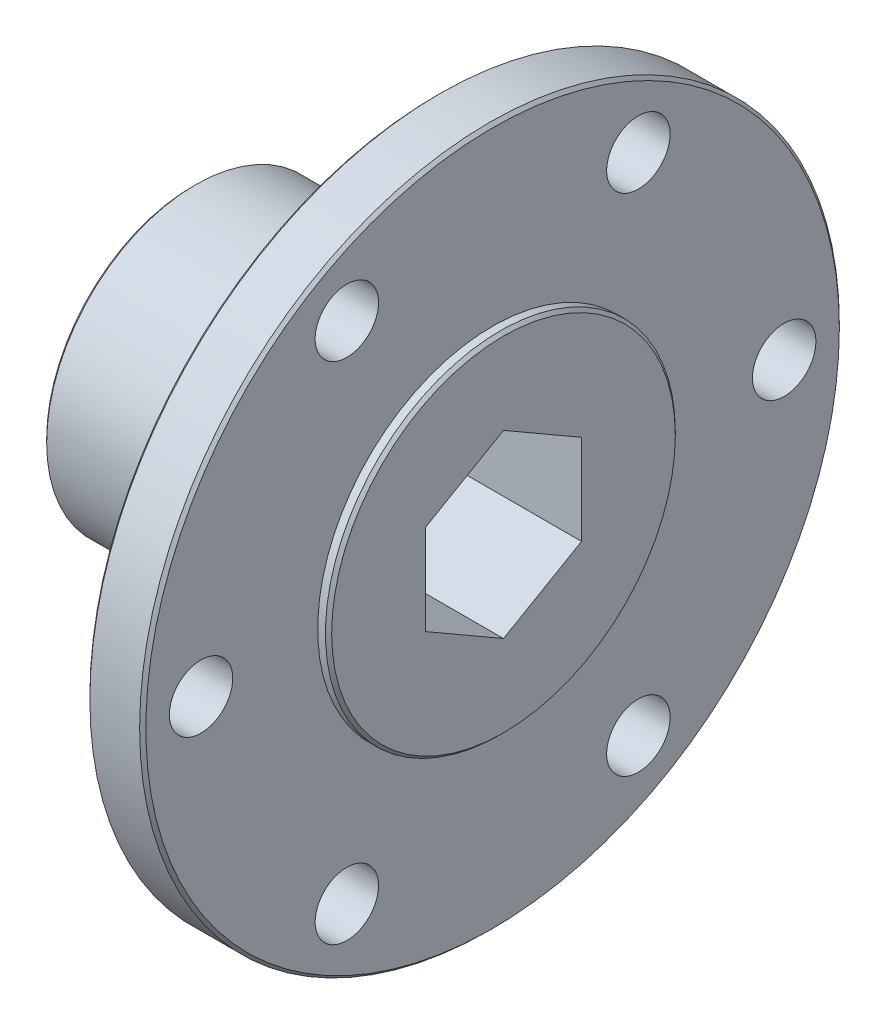
ISO-10303-21;
HEADER;
FILE_DESCRIPTION(('STEP AP214'),'2;1');
FILE_NAME('part.step','',(''),(''),'','','');
FILE_SCHEMA(('AUTOMOTIVE_DESIGN { 1 0 10303 214 1 1 1 1 }'));
ENDSEC;
DATA;
#1=APPLICATION_CONTEXT('core data for automotive mechanical design processes');
#2=APPLICATION_PROTOCOL_DEFINITION('international standard','automotive_design',2000,#1);
#3=PRODUCT_CONTEXT('',#1,'mechanical');
#4=PRODUCT('Part','Part','',(#3));
#5=PRODUCT_RELATED_PRODUCT_CATEGORY('part','',(#4));
#6=PRODUCT_DEFINITION_FORMATION('','',#4);
#7=PRODUCT_DEFINITION_CONTEXT('part definition',#1,'design');
#8=PRODUCT_DEFINITION('design','',#6,#7);
#9=PRODUCT_DEFINITION_SHAPE('','',#8);
#10=(LENGTH_UNIT() NAMED_UNIT(*) SI_UNIT(.MILLI.,.METRE.));
#11=(NAMED_UNIT(*) PLANE_ANGLE_UNIT() SI_UNIT($,.RADIAN.));
#12=(NAMED_UNIT(*) SI_UNIT($,.STERADIAN.) SOLID_ANGLE_UNIT());
#13=UNCERTAINTY_MEASURE_WITH_UNIT(LENGTH_MEASURE(1.E-05),#10,'distance_accuracy_value','');
#14=(GEOMETRIC_REPRESENTATION_CONTEXT(3) GLOBAL_UNCERTAINTY_ASSIGNED_CONTEXT((#13)) GLOBAL_UNIT_ASSIGNED_CONTEXT((#10,
#11,#12)) REPRESENTATION_CONTEXT('',''));
#15=CARTESIAN_POINT('',(0.,0.,0.));
#16=DIRECTION('',(0.,0.,1.));
#17=DIRECTION('',(1.,0.,0.));
#18=AXIS2_PLACEMENT_3D('',#15,#16,#17);
#19=CARTESIAN_POINT('',(-6.01493375394323,0.,0.));
#20=DIRECTION('',(1.,0.,0.));
#21=DIRECTION('',(0.,0.,-1.));
#22=AXIS2_PLACEMENT_3D('',#19,#20,#21);
#23=CYLINDRICAL_SURFACE('',#22,12.1666);
#24=CARTESIAN_POINT('',(-5.76093375394312,0.,0.));
#25=DIRECTION('',(-1.,0.,0.));
#26=DIRECTION('',(0.,0.,1.));
#27=AXIS2_PLACEMENT_3D('',#24,#25,#26);
#28=CIRCLE('',#27,12.1666);
#29=CARTESIAN_POINT('',(-5.76093375394312,0.,12.1666));
#30=VERTEX_POINT('',#29);
#31=EDGE_CURVE('E191',#30,#30,#28,.F.);
#32=ORIENTED_EDGE('',*,*,#31,.T.);
#33=EDGE_LOOP('',(#32));
#34=FACE_BOUND('',#33,.T.);
#35=CARTESIAN_POINT('',(12.2222662460567,0.,0.));
#36=DIRECTION('',(1.,0.,0.));
#37=DIRECTION('',(0.,0.,-1.));
#38=AXIS2_PLACEMENT_3D('',#35,#36,#37);
#39=CIRCLE('',#38,12.1666);
#40=CARTESIAN_POINT('',(12.2222662460567,0.,-12.1666));
#41=VERTEX_POINT('',#40);
#42=EDGE_CURVE('E158',#41,#41,#39,.T.);
#43=ORIENTED_EDGE('',*,*,#42,.F.);
#44=EDGE_LOOP('',(#43));
#45=FACE_BOUND('',#44,.T.);
#46=ADVANCED_FACE('F33',(#34,#45),#23,.T.);
#47=CARTESIAN_POINT('',(-6.01493375394323,12.1666,0.));
#48=DIRECTION('',(-1.,0.,0.));
#49=DIRECTION('',(0.,0.,1.));
#50=AXIS2_PLACEMENT_3D('',#47,#48,#49);
#51=PLANE('',#50);
#52=CARTESIAN_POINT('',(-6.01493375394323,0.,0.));
#53=DIRECTION('',(-1.,0.,0.));
#54=DIRECTION('',(0.,0.,1.));
#55=AXIS2_PLACEMENT_3D('',#52,#53,#54);
#56=CIRCLE('',#55,11.9125999999999);
#57=CARTESIAN_POINT('',(-6.01493375394323,0.,11.9125999999999));
#58=VERTEX_POINT('',#57);
#59=EDGE_CURVE('E194',#58,#58,#56,.T.);
#60=ORIENTED_EDGE('',*,*,#59,.T.);
#61=EDGE_LOOP('',(#60));
#62=FACE_BOUND('',#61,.T.);
#63=DIRECTION('',(0.,0.500000000000001,0.866025403784438));
#64=VECTOR('',#63,1.);
#65=CARTESIAN_POINT('',(-6.01493375394323,3.68081890619155,-6.3754));
#66=LINE('',#65,#64);
#67=CARTESIAN_POINT('',(-6.01493375394323,3.68081890619155,-6.3754));
#68=VERTEX_POINT('',#67);
#69=CARTESIAN_POINT('',(-6.01493375394323,7.3616578123831,0.));
#70=VERTEX_POINT('',#69);
#71=EDGE_CURVE('E88',#68,#70,#66,.T.);
#72=ORIENTED_EDGE('',*,*,#71,.T.);
#73=DIRECTION('',(0.,-0.500000000000001,0.866025403784438));
#74=VECTOR('',#73,1.);
#75=CARTESIAN_POINT('',(-6.01493375394323,7.3616578123831,0.));
#76=LINE('',#75,#74);
#77=CARTESIAN_POINT('',(-6.01493375394323,3.68081890619155,6.37539999999999));
#78=VERTEX_POINT('',#77);
#79=EDGE_CURVE('E97',#70,#78,#76,.T.);
#80=ORIENTED_EDGE('',*,*,#79,.T.);
#81=DIRECTION('',(0.,-1.,0.));
#82=VECTOR('',#81,1.);
#83=CARTESIAN_POINT('',(-6.01493375394323,3.68081890619155,6.37539999999999));
#84=LINE('',#83,#82);
#85=CARTESIAN_POINT('',(-6.01493375394323,-3.68085890619153,6.37539999999999));
#86=VERTEX_POINT('',#85);
#87=EDGE_CURVE('E48',#78,#86,#84,.T.);
#88=ORIENTED_EDGE('',*,*,#87,.T.);
#89=DIRECTION('',(0.,-0.500000000000001,-0.866025403784438));
#90=VECTOR('',#89,1.);
#91=CARTESIAN_POINT('',(-6.01493375394323,-3.68085890619153,6.37539999999999));
#92=LINE('',#91,#90);
#93=CARTESIAN_POINT('',(-6.01493375394323,-7.36169781238308,0.));
#94=VERTEX_POINT('',#93);
#95=EDGE_CURVE('E111',#86,#94,#92,.T.);
#96=ORIENTED_EDGE('',*,*,#95,.T.);
#97=DIRECTION('',(0.,0.500000000000001,-0.866025403784438));
#98=VECTOR('',#97,1.);
#99=CARTESIAN_POINT('',(-6.01493375394323,-7.36169781238308,0.));
#100=LINE('',#99,#98);
#101=CARTESIAN_POINT('',(-6.01493375394323,-3.68085890619153,-6.3754));
#102=VERTEX_POINT('',#101);
#103=EDGE_CURVE('E114',#94,#102,#100,.T.);
#104=ORIENTED_EDGE('',*,*,#103,.T.);
#105=DIRECTION('',(0.,1.,0.));
#106=VECTOR('',#105,1.);
#107=CARTESIAN_POINT('',(-6.01493375394323,-3.68085890619153,-6.3754));
#108=LINE('',#107,#106);
#109=EDGE_CURVE('E94',#102,#68,#108,.T.);
#110=ORIENTED_EDGE('',*,*,#109,.T.);
#111=EDGE_LOOP('',(#72,#80,#88,#96,#104,#110));
#112=FACE_BOUND('',#111,.T.);
#113=ADVANCED_FACE('F101',(#62,#112),#51,.T.);
#114=CARTESIAN_POINT('',(19.3850662460568,0.,0.));
#115=DIRECTION('',(1.,0.,0.));
#116=DIRECTION('',(0.,0.,-1.));
#117=AXIS2_PLACEMENT_3D('',#114,#115,#116);
#118=PLANE('',#117);
#119=CARTESIAN_POINT('',(19.3850662460568,0.,0.));
#120=DIRECTION('',(1.,0.,0.));
#121=DIRECTION('',(0.,0.,-1.));
#122=AXIS2_PLACEMENT_3D('',#119,#120,#121);
#123=CIRCLE('',#122,14.0334999999999);
#124=CARTESIAN_POINT('',(19.3850662460568,0.,-14.0334999999999));
#125=VERTEX_POINT('',#124);
#126=EDGE_CURVE('E170',#125,#125,#123,.T.);
#127=ORIENTED_EDGE('',*,*,#126,.T.);
#128=EDGE_LOOP('',(#127));
#129=FACE_BOUND('',#128,.T.);
#130=DIRECTION('',(0.,0.500000000000001,0.866025403784438));
#131=VECTOR('',#130,1.);
#132=CARTESIAN_POINT('',(19.3850662460568,3.68081890619155,-6.3754));
#133=LINE('',#132,#131);
#134=CARTESIAN_POINT('',(19.3850662460568,3.68081890619155,-6.3754));
#135=VERTEX_POINT('',#134);
#136=CARTESIAN_POINT('',(19.3850662460568,7.3616578123831,0.));
#137=VERTEX_POINT('',#136);
#138=EDGE_CURVE('E56',#135,#137,#133,.T.);
#139=ORIENTED_EDGE('',*,*,#138,.F.);
#140=DIRECTION('',(0.,1.,0.));
#141=VECTOR('',#140,1.);
#142=CARTESIAN_POINT('',(19.3850662460568,-3.68085890619153,-6.3754));
#143=LINE('',#142,#141);
#144=CARTESIAN_POINT('',(19.3850662460568,-3.68085890619153,-6.3754));
#145=VERTEX_POINT('',#144);
#146=EDGE_CURVE('E104',#145,#135,#143,.T.);
#147=ORIENTED_EDGE('',*,*,#146,.F.);
#148=DIRECTION('',(0.,0.500000000000001,-0.866025403784438));
#149=VECTOR('',#148,1.);
#150=CARTESIAN_POINT('',(19.3850662460568,-7.36169781238308,0.));
#151=LINE('',#150,#149);
#152=CARTESIAN_POINT('',(19.3850662460568,-7.36169781238308,0.));
#153=VERTEX_POINT('',#152);
#154=EDGE_CURVE('E107',#153,#145,#151,.T.);
#155=ORIENTED_EDGE('',*,*,#154,.F.);
#156=DIRECTION('',(0.,-0.500000000000001,-0.866025403784438));
#157=VECTOR('',#156,1.);
#158=CARTESIAN_POINT('',(19.3850662460568,-3.68085890619153,6.37539999999999));
#159=LINE('',#158,#157);
#160=CARTESIAN_POINT('',(19.3850662460568,-3.68085890619153,6.37539999999999));
#161=VERTEX_POINT('',#160);
#162=EDGE_CURVE('E123',#161,#153,#159,.T.);
#163=ORIENTED_EDGE('',*,*,#162,.F.);
#164=DIRECTION('',(0.,-1.,0.));
#165=VECTOR('',#164,1.);
#166=CARTESIAN_POINT('',(19.3850662460568,3.68081890619155,6.37539999999999));
#167=LINE('',#166,#165);
#168=CARTESIAN_POINT('',(19.3850662460568,3.68081890619155,6.37539999999999));
#169=VERTEX_POINT('',#168);
#170=EDGE_CURVE('E120',#169,#161,#167,.T.);
#171=ORIENTED_EDGE('',*,*,#170,.F.);
#172=DIRECTION('',(0.,-0.500000000000001,0.866025403784438));
#173=VECTOR('',#172,1.);
#174=CARTESIAN_POINT('',(19.3850662460568,7.3616578123831,0.));
#175=LINE('',#174,#173);
#176=EDGE_CURVE('E118',#137,#169,#175,.T.);
#177=ORIENTED_EDGE('',*,*,#176,.F.);
#178=EDGE_LOOP('',(#139,#147,#155,#163,#171,#177));
#179=FACE_BOUND('',#178,.T.);
#180=ADVANCED_FACE('F244',(#129,#179),#118,.T.);
#181=CARTESIAN_POINT('',(-6.01493375394323,0.,0.));
#182=DIRECTION('',(1.,0.,0.));
#183=DIRECTION('',(0.,0.,-1.));
#184=AXIS2_PLACEMENT_3D('',#181,#182,#183);
#185=CYLINDRICAL_SURFACE('',#184,14.2875);
#186=CARTESIAN_POINT('',(19.1310662460566,0.,0.));
#187=DIRECTION('',(1.,0.,0.));
#188=DIRECTION('',(0.,0.,-1.));
#189=AXIS2_PLACEMENT_3D('',#186,#187,#188);
#190=CIRCLE('',#189,14.2875);
#191=CARTESIAN_POINT('',(19.1310662460566,0.,-14.2875));
#192=VERTEX_POINT('',#191);
#193=EDGE_CURVE('E188',#192,#192,#190,.F.);
#194=ORIENTED_EDGE('',*,*,#193,.T.);
#195=EDGE_LOOP('',(#194));
#196=FACE_BOUND('',#195,.T.);
#197=CARTESIAN_POINT('',(18.4960662460568,0.,0.));
#198=DIRECTION('',(1.,0.,0.));
#199=DIRECTION('',(0.,0.,-1.));
#200=AXIS2_PLACEMENT_3D('',#197,#198,#199);
#201=CIRCLE('',#200,14.2875);
#202=CARTESIAN_POINT('',(18.4960662460568,0.,-14.2875));
#203=VERTEX_POINT('',#202);
#204=EDGE_CURVE('E167',#203,#203,#201,.T.);
#205=ORIENTED_EDGE('',*,*,#204,.T.);
#206=EDGE_LOOP('',(#205));
#207=FACE_BOUND('',#206,.T.);
#208=ADVANCED_FACE('F268',(#196,#207),#185,.T.);
#209=CARTESIAN_POINT('',(18.4960662460568,14.2875,0.));
#210=DIRECTION('',(1.,0.,0.));
#211=DIRECTION('',(0.,0.,-1.));
#212=AXIS2_PLACEMENT_3D('',#209,#210,#211);
#213=PLANE('',#212);
#214=CARTESIAN_POINT('',(18.4960662460568,0.,0.));
#215=DIRECTION('',(1.,0.,0.));
#216=DIRECTION('',(0.,0.,-1.));
#217=AXIS2_PLACEMENT_3D('',#214,#215,#216);
#218=CIRCLE('',#217,28.3209999999999);
#219=CARTESIAN_POINT('',(18.4960662460568,0.,-28.3209999999999));
#220=VERTEX_POINT('',#219);
#221=EDGE_CURVE('E197',#220,#220,#218,.T.);
#222=ORIENTED_EDGE('',*,*,#221,.T.);
#223=EDGE_LOOP('',(#222));
#224=FACE_BOUND('',#223,.T.);
#225=CARTESIAN_POINT('',(18.4960662460568,-20.622229927617,-11.90625));
#226=DIRECTION('',(1.,0.,0.));
#227=DIRECTION('',(0.,-0.866025403784439,0.5));
#228=AXIS2_PLACEMENT_3D('',#225,#226,#227);
#229=CIRCLE('',#228,2.59080000000001);
#230=CARTESIAN_POINT('',(18.4960662460568,-22.8659285437417,-10.61085));
#231=VERTEX_POINT('',#230);
#232=EDGE_CURVE('E138',#231,#231,#229,.T.);
#233=ORIENTED_EDGE('',*,*,#232,.F.);
#234=EDGE_LOOP('',(#233));
#235=FACE_BOUND('',#234,.T.);
#236=CARTESIAN_POINT('',(18.4960662460568,0.,-23.8125));
#237=DIRECTION('',(1.,0.,0.));
#238=DIRECTION('',(0.,-0.866025403784438,-0.500000000000001));
#239=AXIS2_PLACEMENT_3D('',#236,#237,#238);
#240=CIRCLE('',#239,2.59080000000001);
#241=CARTESIAN_POINT('',(18.4960662460568,-2.24369861612477,-25.1079));
#242=VERTEX_POINT('',#241);
#243=EDGE_CURVE('E142',#242,#242,#240,.T.);
#244=ORIENTED_EDGE('',*,*,#243,.F.);
#245=EDGE_LOOP('',(#244));
#246=FACE_BOUND('',#245,.T.);
#247=CARTESIAN_POINT('',(18.4960662460568,20.6222299276169,-11.90625));
#248=DIRECTION('',(1.,0.,0.));
#249=DIRECTION('',(0.,0.,-1.));
#250=AXIS2_PLACEMENT_3D('',#247,#248,#249);
#251=CIRCLE('',#250,2.59080000000001);
#252=CARTESIAN_POINT('',(18.4960662460568,20.6222299276169,-14.49705));
#253=VERTEX_POINT('',#252);
#254=EDGE_CURVE('E145',#253,#253,#251,.T.);
#255=ORIENTED_EDGE('',*,*,#254,.F.);
#256=EDGE_LOOP('',(#255));
#257=FACE_BOUND('',#256,.T.);
#258=CARTESIAN_POINT('',(18.4960662460568,20.622229927617,11.90625));
#259=DIRECTION('',(1.,0.,0.));
#260=DIRECTION('',(0.,0.866025403784439,-0.499999999999999));
#261=AXIS2_PLACEMENT_3D('',#258,#259,#260);
#262=CIRCLE('',#261,2.59080000000001);
#263=CARTESIAN_POINT('',(18.4960662460568,22.8659285437417,10.61085));
#264=VERTEX_POINT('',#263);
#265=EDGE_CURVE('E148',#264,#264,#262,.T.);
#266=ORIENTED_EDGE('',*,*,#265,.F.);
#267=EDGE_LOOP('',(#266));
#268=FACE_BOUND('',#267,.T.);
#269=CARTESIAN_POINT('',(18.4960662460568,0.,23.8125));
#270=DIRECTION('',(1.,0.,0.));
#271=DIRECTION('',(0.,0.866025403784438,0.500000000000002));
#272=AXIS2_PLACEMENT_3D('',#269,#270,#271);
#273=CIRCLE('',#272,2.59080000000001);
#274=CARTESIAN_POINT('',(18.4960662460568,2.24369861612474,25.1079));
#275=VERTEX_POINT('',#274);
#276=EDGE_CURVE('E130',#275,#275,#273,.T.);
#277=ORIENTED_EDGE('',*,*,#276,.F.);
#278=EDGE_LOOP('',(#277));
#279=FACE_BOUND('',#278,.T.);
#280=CARTESIAN_POINT('',(18.4960662460568,-20.6222299276169,11.90625));
#281=DIRECTION('',(1.,0.,0.));
#282=DIRECTION('',(0.,0.,1.));
#283=AXIS2_PLACEMENT_3D('',#280,#281,#282);
#284=CIRCLE('',#283,2.59080000000001);
#285=CARTESIAN_POINT('',(18.4960662460568,-20.6222299276169,14.4970500000001));
#286=VERTEX_POINT('',#285);
#287=EDGE_CURVE('E153',#286,#286,#284,.T.);
#288=ORIENTED_EDGE('',*,*,#287,.F.);
#289=EDGE_LOOP('',(#288));
#290=FACE_BOUND('',#289,.T.);
#291=ORIENTED_EDGE('',*,*,#204,.F.);
#292=EDGE_LOOP('',(#291));
#293=FACE_BOUND('',#292,.T.);
#294=ADVANCED_FACE('F234',(#224,#235,#246,#257,#268,#279,#290,#293),#213,.T.);
#295=CARTESIAN_POINT('',(-6.01493375394323,0.,0.));
#296=DIRECTION('',(1.,0.,0.));
#297=DIRECTION('',(0.,0.,-1.));
#298=AXIS2_PLACEMENT_3D('',#295,#296,#297);
#299=CYLINDRICAL_SURFACE('',#298,28.575);
#300=CARTESIAN_POINT('',(18.2420662460567,0.,0.));
#301=DIRECTION('',(1.,0.,0.));
#302=DIRECTION('',(0.,0.,-1.));
#303=AXIS2_PLACEMENT_3D('',#300,#301,#302);
#304=CIRCLE('',#303,28.575);
#305=CARTESIAN_POINT('',(18.2420662460567,0.,-28.575));
#306=VERTEX_POINT('',#305);
#307=EDGE_CURVE('E203',#306,#306,#304,.F.);
#308=ORIENTED_EDGE('',*,*,#307,.T.);
#309=EDGE_LOOP('',(#308));
#310=FACE_BOUND('',#309,.T.);
#311=CARTESIAN_POINT('',(14.1780662460569,0.,0.));
#312=DIRECTION('',(-1.,0.,0.));
#313=DIRECTION('',(0.,0.,1.));
#314=AXIS2_PLACEMENT_3D('',#311,#312,#313);
#315=CIRCLE('',#314,28.575);
#316=CARTESIAN_POINT('',(14.1780662460569,0.,28.575));
#317=VERTEX_POINT('',#316);
#318=EDGE_CURVE('E200',#317,#317,#315,.F.);
#319=ORIENTED_EDGE('',*,*,#318,.T.);
#320=EDGE_LOOP('',(#319));
#321=FACE_BOUND('',#320,.T.);
#322=ADVANCED_FACE('F228',(#310,#321),#299,.T.);
#323=CARTESIAN_POINT('',(13.9240662460568,28.575,0.));
#324=DIRECTION('',(-1.,0.,0.));
#325=DIRECTION('',(0.,0.,1.));
#326=AXIS2_PLACEMENT_3D('',#323,#324,#325);
#327=PLANE('',#326);
#328=CARTESIAN_POINT('',(13.9240662460568,0.,0.));
#329=DIRECTION('',(-1.,0.,0.));
#330=DIRECTION('',(0.,0.,1.));
#331=AXIS2_PLACEMENT_3D('',#328,#329,#330);
#332=CIRCLE('',#331,28.3209999999999);
#333=CARTESIAN_POINT('',(13.9240662460568,0.,28.3209999999999));
#334=VERTEX_POINT('',#333);
#335=EDGE_CURVE('E11',#334,#334,#332,.T.);
#336=ORIENTED_EDGE('',*,*,#335,.T.);
#337=EDGE_LOOP('',(#336));
#338=FACE_BOUND('',#337,.T.);
#339=CARTESIAN_POINT('',(13.9240662460568,-20.622229927617,-11.90625));
#340=DIRECTION('',(-1.,0.,0.));
#341=DIRECTION('',(0.,0.,1.));
#342=AXIS2_PLACEMENT_3D('',#339,#340,#341);
#343=CIRCLE('',#342,2.59080000000001);
#344=CARTESIAN_POINT('',(13.9240662460568,-20.622229927617,-9.31544999999995));
#345=VERTEX_POINT('',#344);
#346=EDGE_CURVE('E157',#345,#345,#343,.T.);
#347=ORIENTED_EDGE('',*,*,#346,.F.);
#348=EDGE_LOOP('',(#347));
#349=FACE_BOUND('',#348,.T.);
#350=CARTESIAN_POINT('',(13.9240662460568,0.,-23.8125));
#351=DIRECTION('',(-1.,0.,0.));
#352=DIRECTION('',(0.,0.,1.));
#353=AXIS2_PLACEMENT_3D('',#350,#351,#352);
#354=CIRCLE('',#353,2.59080000000001);
#355=CARTESIAN_POINT('',(13.9240662460568,0.,-21.2217));
#356=VERTEX_POINT('',#355);
#357=EDGE_CURVE('E181',#356,#356,#354,.T.);
#358=ORIENTED_EDGE('',*,*,#357,.F.);
#359=EDGE_LOOP('',(#358));
#360=FACE_BOUND('',#359,.T.);
#361=CARTESIAN_POINT('',(13.9240662460568,20.6222299276169,-11.90625));
#362=DIRECTION('',(-1.,0.,0.));
#363=DIRECTION('',(0.,0.,1.));
#364=AXIS2_PLACEMENT_3D('',#361,#362,#363);
#365=CIRCLE('',#364,2.59080000000001);
#366=CARTESIAN_POINT('',(13.9240662460568,20.6222299276169,-9.31545000000001));
#367=VERTEX_POINT('',#366);
#368=EDGE_CURVE('E178',#367,#367,#365,.T.);
#369=ORIENTED_EDGE('',*,*,#368,.F.);
#370=EDGE_LOOP('',(#369));
#371=FACE_BOUND('',#370,.T.);
#372=CARTESIAN_POINT('',(13.9240662460568,20.622229927617,11.90625));
#373=DIRECTION('',(-1.,0.,0.));
#374=DIRECTION('',(0.,0.,1.));
#375=AXIS2_PLACEMENT_3D('',#372,#373,#374);
#376=CIRCLE('',#375,2.59080000000001);
#377=CARTESIAN_POINT('',(13.9240662460568,20.622229927617,14.49705));
#378=VERTEX_POINT('',#377);
#379=EDGE_CURVE('E175',#378,#378,#376,.T.);
#380=ORIENTED_EDGE('',*,*,#379,.F.);
#381=EDGE_LOOP('',(#380));
#382=FACE_BOUND('',#381,.T.);
#383=CARTESIAN_POINT('',(13.9240662460568,0.,23.8125));
#384=DIRECTION('',(-1.,0.,0.));
#385=DIRECTION('',(0.,0.,1.));
#386=AXIS2_PLACEMENT_3D('',#383,#384,#385);
#387=CIRCLE('',#386,2.59080000000001);
#388=CARTESIAN_POINT('',(13.9240662460568,0.,26.4033));
#389=VERTEX_POINT('',#388);
#390=EDGE_CURVE('E141',#389,#389,#387,.T.);
#391=ORIENTED_EDGE('',*,*,#390,.F.);
#392=EDGE_LOOP('',(#391));
#393=FACE_BOUND('',#392,.T.);
#394=CARTESIAN_POINT('',(13.9240662460568,-20.6222299276169,11.90625));
#395=DIRECTION('',(-1.,0.,0.));
#396=DIRECTION('',(0.,0.,1.));
#397=AXIS2_PLACEMENT_3D('',#394,#395,#396);
#398=CIRCLE('',#397,2.59080000000001);
#399=CARTESIAN_POINT('',(13.9240662460568,-20.6222299276169,14.4970500000001));
#400=VERTEX_POINT('',#399);
#401=EDGE_CURVE('E156',#400,#400,#398,.T.);
#402=ORIENTED_EDGE('',*,*,#401,.F.);
#403=EDGE_LOOP('',(#402));
#404=FACE_BOUND('',#403,.T.);
#405=CARTESIAN_POINT('',(13.9240662460568,0.,0.));
#406=DIRECTION('',(1.,0.,0.));
#407=DIRECTION('',(0.,0.,-1.));
#408=AXIS2_PLACEMENT_3D('',#405,#406,#407);
#409=CIRCLE('',#408,14.2875);
#410=CARTESIAN_POINT('',(13.9240662460568,0.,-14.2875));
#411=VERTEX_POINT('',#410);
#412=EDGE_CURVE('E164',#411,#411,#409,.T.);
#413=ORIENTED_EDGE('',*,*,#412,.T.);
#414=EDGE_LOOP('',(#413));
#415=FACE_BOUND('',#414,.T.);
#416=ADVANCED_FACE('F223',(#338,#349,#360,#371,#382,#393,#404,#415),#327,.T.);
#417=CARTESIAN_POINT('',(-6.01493375394323,0.,0.));
#418=DIRECTION('',(1.,0.,0.));
#419=DIRECTION('',(0.,0.,-1.));
#420=AXIS2_PLACEMENT_3D('',#417,#418,#419);
#421=CYLINDRICAL_SURFACE('',#420,14.2875);
#422=CARTESIAN_POINT('',(13.2890662460569,0.,0.));
#423=DIRECTION('',(-1.,0.,0.));
#424=DIRECTION('',(0.,0.,1.));
#425=AXIS2_PLACEMENT_3D('',#422,#423,#424);
#426=CIRCLE('',#425,14.2875);
#427=CARTESIAN_POINT('',(13.2890662460569,0.,14.2875));
#428=VERTEX_POINT('',#427);
#429=EDGE_CURVE('E206',#428,#428,#426,.F.);
#430=ORIENTED_EDGE('',*,*,#429,.T.);
#431=EDGE_LOOP('',(#430));
#432=FACE_BOUND('',#431,.T.);
#433=ORIENTED_EDGE('',*,*,#412,.F.);
#434=EDGE_LOOP('',(#433));
#435=FACE_BOUND('',#434,.T.);
#436=ADVANCED_FACE('F220',(#432,#435),#421,.T.);
#437=CARTESIAN_POINT('',(13.0350662460568,14.2875,0.));
#438=DIRECTION('',(-1.,0.,0.));
#439=DIRECTION('',(0.,0.,1.));
#440=AXIS2_PLACEMENT_3D('',#437,#438,#439);
#441=PLANE('',#440);
#442=CARTESIAN_POINT('',(13.0350662460568,0.,0.));
#443=DIRECTION('',(-1.,0.,0.));
#444=DIRECTION('',(0.,0.,1.));
#445=AXIS2_PLACEMENT_3D('',#442,#443,#444);
#446=CIRCLE('',#445,14.0334999999999);
#447=CARTESIAN_POINT('',(13.0350662460568,0.,14.0334999999999));
#448=VERTEX_POINT('',#447);
#449=EDGE_CURVE('E41',#448,#448,#446,.T.);
#450=ORIENTED_EDGE('',*,*,#449,.T.);
#451=EDGE_LOOP('',(#450));
#452=FACE_BOUND('',#451,.T.);
#453=CARTESIAN_POINT('',(13.0350662460568,0.,0.));
#454=DIRECTION('',(1.,0.,0.));
#455=DIRECTION('',(0.,0.,-1.));
#456=AXIS2_PLACEMENT_3D('',#453,#454,#455);
#457=CIRCLE('',#456,12.9794);
#458=CARTESIAN_POINT('',(13.0350662460568,0.,-12.9794));
#459=VERTEX_POINT('',#458);
#460=EDGE_CURVE('E161',#459,#459,#457,.T.);
#461=ORIENTED_EDGE('',*,*,#460,.T.);
#462=EDGE_LOOP('',(#461));
#463=FACE_BOUND('',#462,.T.);
#464=ADVANCED_FACE('F211',(#452,#463),#441,.T.);
#465=CARTESIAN_POINT('',(13.0350662460568,0.,0.));
#466=DIRECTION('',(1.,0.,0.));
#467=DIRECTION('',(0.,0.,-1.));
#468=AXIS2_PLACEMENT_3D('',#465,#466,#467);
#469=CONICAL_SURFACE('',#468,12.9794,0.785398163397438);
#470=ORIENTED_EDGE('',*,*,#42,.T.);
#471=EDGE_LOOP('',(#470));
#472=FACE_BOUND('',#471,.T.);
#473=ORIENTED_EDGE('',*,*,#460,.F.);
#474=EDGE_LOOP('',(#473));
#475=FACE_BOUND('',#474,.T.);
#476=ADVANCED_FACE('F346',(#472,#475),#469,.T.);
#477=CARTESIAN_POINT('',(-6.01493375394323,-20.6222299276169,11.90625));
#478=DIRECTION('',(1.,0.,0.));
#479=DIRECTION('',(0.,0.,-1.));
#480=AXIS2_PLACEMENT_3D('',#477,#478,#479);
#481=CYLINDRICAL_SURFACE('',#480,2.59080000000001);
#482=ORIENTED_EDGE('',*,*,#401,.T.);
#483=EDGE_LOOP('',(#482));
#484=FACE_BOUND('',#483,.T.);
#485=ORIENTED_EDGE('',*,*,#287,.T.);
#486=EDGE_LOOP('',(#485));
#487=FACE_BOUND('',#486,.T.);
#488=ADVANCED_FACE('F342',(#484,#487),#481,.F.);
#489=CARTESIAN_POINT('',(-6.01493375394323,0.,23.8125));
#490=DIRECTION('',(1.,0.,0.));
#491=DIRECTION('',(0.,0.,-1.));
#492=AXIS2_PLACEMENT_3D('',#489,#490,#491);
#493=CYLINDRICAL_SURFACE('',#492,2.59080000000001);
#494=ORIENTED_EDGE('',*,*,#390,.T.);
#495=EDGE_LOOP('',(#494));
#496=FACE_BOUND('',#495,.T.);
#497=ORIENTED_EDGE('',*,*,#276,.T.);
#498=EDGE_LOOP('',(#497));
#499=FACE_BOUND('',#498,.T.);
#500=ADVANCED_FACE('F338',(#496,#499),#493,.F.);
#501=CARTESIAN_POINT('',(-6.01493375394323,20.622229927617,11.90625));
#502=DIRECTION('',(1.,0.,0.));
#503=DIRECTION('',(0.,0.,-1.));
#504=AXIS2_PLACEMENT_3D('',#501,#502,#503);
#505=CYLINDRICAL_SURFACE('',#504,2.59080000000001);
#506=ORIENTED_EDGE('',*,*,#379,.T.);
#507=EDGE_LOOP('',(#506));
#508=FACE_BOUND('',#507,.T.);
#509=ORIENTED_EDGE('',*,*,#265,.T.);
#510=EDGE_LOOP('',(#509));
#511=FACE_BOUND('',#510,.T.);
#512=ADVANCED_FACE('F334',(#508,#511),#505,.F.);
#513=CARTESIAN_POINT('',(-6.01493375394323,20.6222299276169,-11.90625));
#514=DIRECTION('',(1.,0.,0.));
#515=DIRECTION('',(0.,0.,-1.));
#516=AXIS2_PLACEMENT_3D('',#513,#514,#515);
#517=CYLINDRICAL_SURFACE('',#516,2.59080000000001);
#518=ORIENTED_EDGE('',*,*,#368,.T.);
#519=EDGE_LOOP('',(#518));
#520=FACE_BOUND('',#519,.T.);
#521=ORIENTED_EDGE('',*,*,#254,.T.);
#522=EDGE_LOOP('',(#521));
#523=FACE_BOUND('',#522,.T.);
#524=ADVANCED_FACE('F330',(#520,#523),#517,.F.);
#525=CARTESIAN_POINT('',(-6.01493375394323,0.,-23.8125));
#526=DIRECTION('',(1.,0.,0.));
#527=DIRECTION('',(0.,0.,-1.));
#528=AXIS2_PLACEMENT_3D('',#525,#526,#527);
#529=CYLINDRICAL_SURFACE('',#528,2.59080000000001);
#530=ORIENTED_EDGE('',*,*,#357,.T.);
#531=EDGE_LOOP('',(#530));
#532=FACE_BOUND('',#531,.T.);
#533=ORIENTED_EDGE('',*,*,#243,.T.);
#534=EDGE_LOOP('',(#533));
#535=FACE_BOUND('',#534,.T.);
#536=ADVANCED_FACE('F326',(#532,#535),#529,.F.);
#537=CARTESIAN_POINT('',(-6.01493375394323,-20.622229927617,-11.90625));
#538=DIRECTION('',(1.,0.,0.));
#539=DIRECTION('',(0.,0.,-1.));
#540=AXIS2_PLACEMENT_3D('',#537,#538,#539);
#541=CYLINDRICAL_SURFACE('',#540,2.59080000000001);
#542=ORIENTED_EDGE('',*,*,#346,.T.);
#543=EDGE_LOOP('',(#542));
#544=FACE_BOUND('',#543,.T.);
#545=ORIENTED_EDGE('',*,*,#232,.T.);
#546=EDGE_LOOP('',(#545));
#547=FACE_BOUND('',#546,.T.);
#548=ADVANCED_FACE('F315',(#544,#547),#541,.F.);
#549=CARTESIAN_POINT('',(-6.01493375394323,3.68081890619155,-6.3754));
#550=DIRECTION('',(0.,0.866025403784438,-0.500000000000001));
#551=DIRECTION('',(0.,0.500000000000001,0.866025403784438));
#552=AXIS2_PLACEMENT_3D('',#549,#550,#551);
#553=PLANE('',#552);
#554=ORIENTED_EDGE('',*,*,#138,.T.);
#555=DIRECTION('',(1.,0.,0.));
#556=VECTOR('',#555,1.);
#557=CARTESIAN_POINT('',(-6.01493375394323,7.3616578123831,0.));
#558=LINE('',#557,#556);
#559=EDGE_CURVE('E84',#70,#137,#558,.T.);
#560=ORIENTED_EDGE('',*,*,#559,.F.);
#561=ORIENTED_EDGE('',*,*,#71,.F.);
#562=DIRECTION('',(1.,0.,0.));
#563=VECTOR('',#562,1.);
#564=CARTESIAN_POINT('',(-6.01493375394323,3.68081890619155,-6.3754));
#565=LINE('',#564,#563);
#566=EDGE_CURVE('E128',#68,#135,#565,.T.);
#567=ORIENTED_EDGE('',*,*,#566,.T.);
#568=EDGE_LOOP('',(#554,#560,#561,#567));
#569=FACE_BOUND('',#568,.T.);
#570=ADVANCED_FACE('F86',(#569),#553,.F.);
#571=CARTESIAN_POINT('',(-6.01493375394323,-3.68085890619153,-6.3754));
#572=DIRECTION('',(0.,0.,-1.));
#573=DIRECTION('',(0.,1.,0.));
#574=AXIS2_PLACEMENT_3D('',#571,#572,#573);
#575=PLANE('',#574);
#576=ORIENTED_EDGE('',*,*,#146,.T.);
#577=ORIENTED_EDGE('',*,*,#566,.F.);
#578=ORIENTED_EDGE('',*,*,#109,.F.);
#579=DIRECTION('',(1.,0.,0.));
#580=VECTOR('',#579,1.);
#581=CARTESIAN_POINT('',(-6.01493375394323,-3.68085890619153,-6.3754));
#582=LINE('',#581,#580);
#583=EDGE_CURVE('E131',#102,#145,#582,.T.);
#584=ORIENTED_EDGE('',*,*,#583,.T.);
#585=EDGE_LOOP('',(#576,#577,#578,#584));
#586=FACE_BOUND('',#585,.T.);
#587=ADVANCED_FACE('F307',(#586),#575,.F.);
#588=CARTESIAN_POINT('',(-6.01493375394323,-7.36169781238308,0.));
#589=DIRECTION('',(0.,-0.866025403784438,-0.500000000000001));
#590=DIRECTION('',(0.,0.500000000000001,-0.866025403784438));
#591=AXIS2_PLACEMENT_3D('',#588,#589,#590);
#592=PLANE('',#591);
#593=ORIENTED_EDGE('',*,*,#154,.T.);
#594=ORIENTED_EDGE('',*,*,#583,.F.);
#595=ORIENTED_EDGE('',*,*,#103,.F.);
#596=DIRECTION('',(1.,0.,0.));
#597=VECTOR('',#596,1.);
#598=CARTESIAN_POINT('',(-6.01493375394323,-7.36169781238308,0.));
#599=LINE('',#598,#597);
#600=EDGE_CURVE('E133',#94,#153,#599,.T.);
#601=ORIENTED_EDGE('',*,*,#600,.T.);
#602=EDGE_LOOP('',(#593,#594,#595,#601));
#603=FACE_BOUND('',#602,.T.);
#604=ADVANCED_FACE('F305',(#603),#592,.F.);
#605=CARTESIAN_POINT('',(-6.01493375394323,-3.68085890619153,6.37539999999999));
#606=DIRECTION('',(0.,-0.866025403784438,0.500000000000001));
#607=DIRECTION('',(0.,-0.500000000000001,-0.866025403784438));
#608=AXIS2_PLACEMENT_3D('',#605,#606,#607);
#609=PLANE('',#608);
#610=ORIENTED_EDGE('',*,*,#162,.T.);
#611=ORIENTED_EDGE('',*,*,#600,.F.);
#612=ORIENTED_EDGE('',*,*,#95,.F.);
#613=DIRECTION('',(1.,0.,0.));
#614=VECTOR('',#613,1.);
#615=CARTESIAN_POINT('',(-6.01493375394323,-3.68085890619153,6.37539999999999));
#616=LINE('',#615,#614);
#617=EDGE_CURVE('E135',#86,#161,#616,.T.);
#618=ORIENTED_EDGE('',*,*,#617,.T.);
#619=EDGE_LOOP('',(#610,#611,#612,#618));
#620=FACE_BOUND('',#619,.T.);
#621=ADVANCED_FACE('F302',(#620),#609,.F.);
#622=CARTESIAN_POINT('',(-6.01493375394323,3.68081890619155,6.37539999999999));
#623=DIRECTION('',(0.,0.,1.));
#624=DIRECTION('',(0.,-1.,0.));
#625=AXIS2_PLACEMENT_3D('',#622,#623,#624);
#626=PLANE('',#625);
#627=ORIENTED_EDGE('',*,*,#170,.T.);
#628=ORIENTED_EDGE('',*,*,#617,.F.);
#629=ORIENTED_EDGE('',*,*,#87,.F.);
#630=DIRECTION('',(1.,0.,0.));
#631=VECTOR('',#630,1.);
#632=CARTESIAN_POINT('',(-6.01493375394323,3.68081890619155,6.37539999999999));
#633=LINE('',#632,#631);
#634=EDGE_CURVE('E93',#78,#169,#633,.T.);
#635=ORIENTED_EDGE('',*,*,#634,.T.);
#636=EDGE_LOOP('',(#627,#628,#629,#635));
#637=FACE_BOUND('',#636,.T.);
#638=ADVANCED_FACE('F299',(#637),#626,.F.);
#639=CARTESIAN_POINT('',(-6.01493375394323,7.3616578123831,0.));
#640=DIRECTION('',(0.,0.866025403784438,0.500000000000001));
#641=DIRECTION('',(0.,-0.500000000000001,0.866025403784438));
#642=AXIS2_PLACEMENT_3D('',#639,#640,#641);
#643=PLANE('',#642);
#644=ORIENTED_EDGE('',*,*,#176,.T.);
#645=ORIENTED_EDGE('',*,*,#634,.F.);
#646=ORIENTED_EDGE('',*,*,#79,.F.);
#647=ORIENTED_EDGE('',*,*,#559,.T.);
#648=EDGE_LOOP('',(#644,#645,#646,#647));
#649=FACE_BOUND('',#648,.T.);
#650=ADVANCED_FACE('F98',(#649),#643,.F.);
#651=CARTESIAN_POINT('',(19.3850662460568,0.,0.));
#652=DIRECTION('',(-1.,0.,0.));
#653=DIRECTION('',(0.,0.,1.));
#654=AXIS2_PLACEMENT_3D('',#651,#652,#653);
#655=CONICAL_SURFACE('',#654,14.0334999999999,0.785398163397448);
#656=ORIENTED_EDGE('',*,*,#193,.F.);
#657=EDGE_LOOP('',(#656));
#658=FACE_BOUND('',#657,.T.);
#659=ORIENTED_EDGE('',*,*,#126,.F.);
#660=EDGE_LOOP('',(#659));
#661=FACE_BOUND('',#660,.T.);
#662=ADVANCED_FACE('F250',(#658,#661),#655,.T.);
#663=CARTESIAN_POINT('',(-5.76093375394312,0.,0.));
#664=DIRECTION('',(1.,0.,0.));
#665=DIRECTION('',(0.,0.,-1.));
#666=AXIS2_PLACEMENT_3D('',#663,#664,#665);
#667=CONICAL_SURFACE('',#666,12.1666,0.785398163397452);
#668=ORIENTED_EDGE('',*,*,#59,.F.);
#669=EDGE_LOOP('',(#668));
#670=FACE_BOUND('',#669,.T.);
#671=ORIENTED_EDGE('',*,*,#31,.F.);
#672=EDGE_LOOP('',(#671));
#673=FACE_BOUND('',#672,.T.);
#674=ADVANCED_FACE('F253',(#670,#673),#667,.T.);
#675=CARTESIAN_POINT('',(18.4960662460568,0.,0.));
#676=DIRECTION('',(-1.,0.,0.));
#677=DIRECTION('',(0.,0.,1.));
#678=AXIS2_PLACEMENT_3D('',#675,#676,#677);
#679=CONICAL_SURFACE('',#678,28.3209999999999,0.785398163397455);
#680=ORIENTED_EDGE('',*,*,#307,.F.);
#681=EDGE_LOOP('',(#680));
#682=FACE_BOUND('',#681,.T.);
#683=ORIENTED_EDGE('',*,*,#221,.F.);
#684=EDGE_LOOP('',(#683));
#685=FACE_BOUND('',#684,.T.);
#686=ADVANCED_FACE('F217',(#682,#685),#679,.T.);
#687=CARTESIAN_POINT('',(13.2890662460569,0.,0.));
#688=DIRECTION('',(1.,0.,0.));
#689=DIRECTION('',(0.,0.,-1.));
#690=AXIS2_PLACEMENT_3D('',#687,#688,#689);
#691=CONICAL_SURFACE('',#690,14.2875,0.785398163397452);
#692=ORIENTED_EDGE('',*,*,#449,.F.);
#693=EDGE_LOOP('',(#692));
#694=FACE_BOUND('',#693,.T.);
#695=ORIENTED_EDGE('',*,*,#429,.F.);
#696=EDGE_LOOP('',(#695));
#697=FACE_BOUND('',#696,.T.);
#698=ADVANCED_FACE('F214',(#694,#697),#691,.T.);
#699=CARTESIAN_POINT('',(14.1780662460569,0.,0.));
#700=DIRECTION('',(1.,0.,0.));
#701=DIRECTION('',(0.,0.,-1.));
#702=AXIS2_PLACEMENT_3D('',#699,#700,#701);
#703=CONICAL_SURFACE('',#702,28.575,0.785398163397455);
#704=ORIENTED_EDGE('',*,*,#335,.F.);
#705=EDGE_LOOP('',(#704));
#706=FACE_BOUND('',#705,.T.);
#707=ORIENTED_EDGE('',*,*,#318,.F.);
#708=EDGE_LOOP('',(#707));
#709=FACE_BOUND('',#708,.T.);
#710=ADVANCED_FACE('F35',(#706,#709),#703,.T.);
#711=CLOSED_SHELL('',(#46,#113,#180,#208,#294,#322,#416,#436,#464,#476,#488,#500,#512,#524,#536,
#548,#570,#587,#604,#621,#638,#650,#662,#674,#686,#698,#710));
#712=MANIFOLD_SOLID_BREP('B2',#711);
#713=ADVANCED_BREP_SHAPE_REPRESENTATION('',(#18,#712),#14);
#714=SHAPE_DEFINITION_REPRESENTATION(#9,#713);
ENDSEC;
END-ISO-10303-21;
